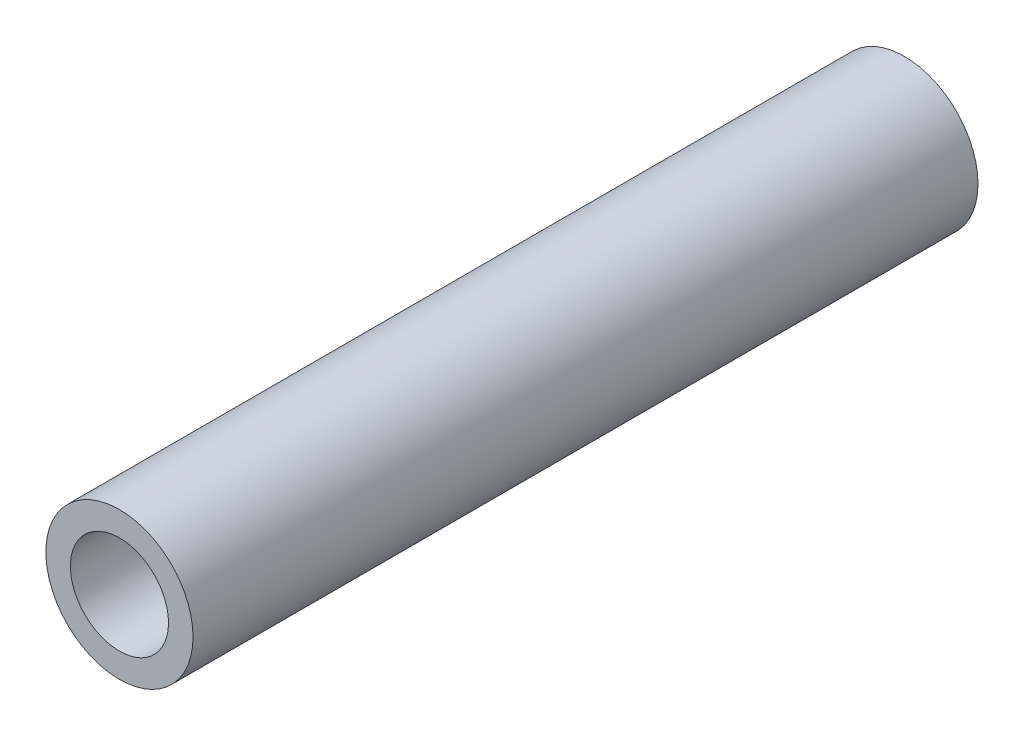
ISO-10303-21;
HEADER;
FILE_DESCRIPTION(('STEP AP214'),'2;1');
FILE_NAME('part.step','',(''),(''),'','','');
FILE_SCHEMA(('AUTOMOTIVE_DESIGN { 1 0 10303 214 1 1 1 1 }'));
ENDSEC;
DATA;
#1=APPLICATION_CONTEXT('core data for automotive mechanical design processes');
#2=APPLICATION_PROTOCOL_DEFINITION('international standard','automotive_design',2000,#1);
#3=PRODUCT_CONTEXT('',#1,'mechanical');
#4=PRODUCT('Part','Part','',(#3));
#5=PRODUCT_RELATED_PRODUCT_CATEGORY('part','',(#4));
#6=PRODUCT_DEFINITION_FORMATION('','',#4);
#7=PRODUCT_DEFINITION_CONTEXT('part definition',#1,'design');
#8=PRODUCT_DEFINITION('design','',#6,#7);
#9=PRODUCT_DEFINITION_SHAPE('','',#8);
#10=(LENGTH_UNIT() NAMED_UNIT(*) SI_UNIT(.MILLI.,.METRE.));
#11=(NAMED_UNIT(*) PLANE_ANGLE_UNIT() SI_UNIT($,.RADIAN.));
#12=(NAMED_UNIT(*) SI_UNIT($,.STERADIAN.) SOLID_ANGLE_UNIT());
#13=UNCERTAINTY_MEASURE_WITH_UNIT(LENGTH_MEASURE(1.E-05),#10,'distance_accuracy_value','');
#14=(GEOMETRIC_REPRESENTATION_CONTEXT(3) GLOBAL_UNCERTAINTY_ASSIGNED_CONTEXT((#13)) GLOBAL_UNIT_ASSIGNED_CONTEXT((#10,
#11,#12)) REPRESENTATION_CONTEXT('',''));
#15=CARTESIAN_POINT('',(0.,0.,0.));
#16=DIRECTION('',(0.,0.,1.));
#17=DIRECTION('',(1.,0.,0.));
#18=AXIS2_PLACEMENT_3D('',#15,#16,#17);
#19=CARTESIAN_POINT('',(0.,0.,0.));
#20=DIRECTION('',(0.,0.,1.));
#21=DIRECTION('',(1.,0.,0.));
#22=AXIS2_PLACEMENT_3D('',#19,#20,#21);
#23=CYLINDRICAL_SURFACE('',#22,0.75);
#24=CARTESIAN_POINT('',(0.,0.,0.));
#25=DIRECTION('',(0.,0.,1.));
#26=DIRECTION('',(1.,0.,0.));
#27=AXIS2_PLACEMENT_3D('',#24,#25,#26);
#28=CIRCLE('',#27,0.75);
#29=CARTESIAN_POINT('',(0.75,0.,0.));
#30=VERTEX_POINT('',#29);
#31=EDGE_CURVE('E27',#30,#30,#28,.F.);
#32=ORIENTED_EDGE('',*,*,#31,.F.);
#33=EDGE_LOOP('',(#32));
#34=FACE_BOUND('',#33,.T.);
#35=CARTESIAN_POINT('',(0.,0.,8.00000000000001));
#36=DIRECTION('',(0.,0.,1.));
#37=DIRECTION('',(1.,0.,0.));
#38=AXIS2_PLACEMENT_3D('',#35,#36,#37);
#39=CIRCLE('',#38,0.75);
#40=CARTESIAN_POINT('',(0.75,0.,8.00000000000001));
#41=VERTEX_POINT('',#40);
#42=EDGE_CURVE('E18',#41,#41,#39,.T.);
#43=ORIENTED_EDGE('',*,*,#42,.F.);
#44=EDGE_LOOP('',(#43));
#45=FACE_BOUND('',#44,.T.);
#46=ADVANCED_FACE('F15',(#34,#45),#23,.T.);
#47=CARTESIAN_POINT('',(0.,0.,8.00000000000001));
#48=DIRECTION('',(0.,0.,1.));
#49=DIRECTION('',(1.,0.,0.));
#50=AXIS2_PLACEMENT_3D('',#47,#48,#49);
#51=PLANE('',#50);
#52=CARTESIAN_POINT('',(0.,0.,8.00000000000001));
#53=DIRECTION('',(0.,0.,1.));
#54=DIRECTION('',(1.,0.,0.));
#55=AXIS2_PLACEMENT_3D('',#52,#53,#54);
#56=CIRCLE('',#55,0.499999999999999);
#57=CARTESIAN_POINT('',(0.499999999999999,0.,8.00000000000001));
#58=VERTEX_POINT('',#57);
#59=EDGE_CURVE('E22',#58,#58,#56,.T.);
#60=ORIENTED_EDGE('',*,*,#59,.F.);
#61=EDGE_LOOP('',(#60));
#62=FACE_BOUND('',#61,.T.);
#63=ORIENTED_EDGE('',*,*,#42,.T.);
#64=EDGE_LOOP('',(#63));
#65=FACE_BOUND('',#64,.T.);
#66=ADVANCED_FACE('F35',(#62,#65),#51,.T.);
#67=CARTESIAN_POINT('',(0.,0.,0.));
#68=DIRECTION('',(0.,0.,-1.));
#69=DIRECTION('',(-1.,0.,0.));
#70=AXIS2_PLACEMENT_3D('',#67,#68,#69);
#71=PLANE('',#70);
#72=CARTESIAN_POINT('',(0.,0.,0.));
#73=DIRECTION('',(0.,0.,1.));
#74=DIRECTION('',(1.,0.,0.));
#75=AXIS2_PLACEMENT_3D('',#72,#73,#74);
#76=CIRCLE('',#75,0.499999999999999);
#77=CARTESIAN_POINT('',(0.499999999999999,0.,0.));
#78=VERTEX_POINT('',#77);
#79=EDGE_CURVE('E10',#78,#78,#76,.F.);
#80=ORIENTED_EDGE('',*,*,#79,.F.);
#81=EDGE_LOOP('',(#80));
#82=FACE_BOUND('',#81,.T.);
#83=ORIENTED_EDGE('',*,*,#31,.T.);
#84=EDGE_LOOP('',(#83));
#85=FACE_BOUND('',#84,.T.);
#86=ADVANCED_FACE('F43',(#82,#85),#71,.T.);
#87=CARTESIAN_POINT('',(0.,0.,0.));
#88=DIRECTION('',(0.,0.,1.));
#89=DIRECTION('',(1.,0.,0.));
#90=AXIS2_PLACEMENT_3D('',#87,#88,#89);
#91=CYLINDRICAL_SURFACE('',#90,0.499999999999999);
#92=ORIENTED_EDGE('',*,*,#79,.T.);
#93=EDGE_LOOP('',(#92));
#94=FACE_BOUND('',#93,.T.);
#95=ORIENTED_EDGE('',*,*,#59,.T.);
#96=EDGE_LOOP('',(#95));
#97=FACE_BOUND('',#96,.T.);
#98=ADVANCED_FACE('F45',(#94,#97),#91,.F.);
#99=CLOSED_SHELL('',(#46,#66,#86,#98));
#100=MANIFOLD_SOLID_BREP('B1',#99);
#101=ADVANCED_BREP_SHAPE_REPRESENTATION('',(#18,#100),#14);
#102=SHAPE_DEFINITION_REPRESENTATION(#9,#101);
ENDSEC;
END-ISO-10303-21;
